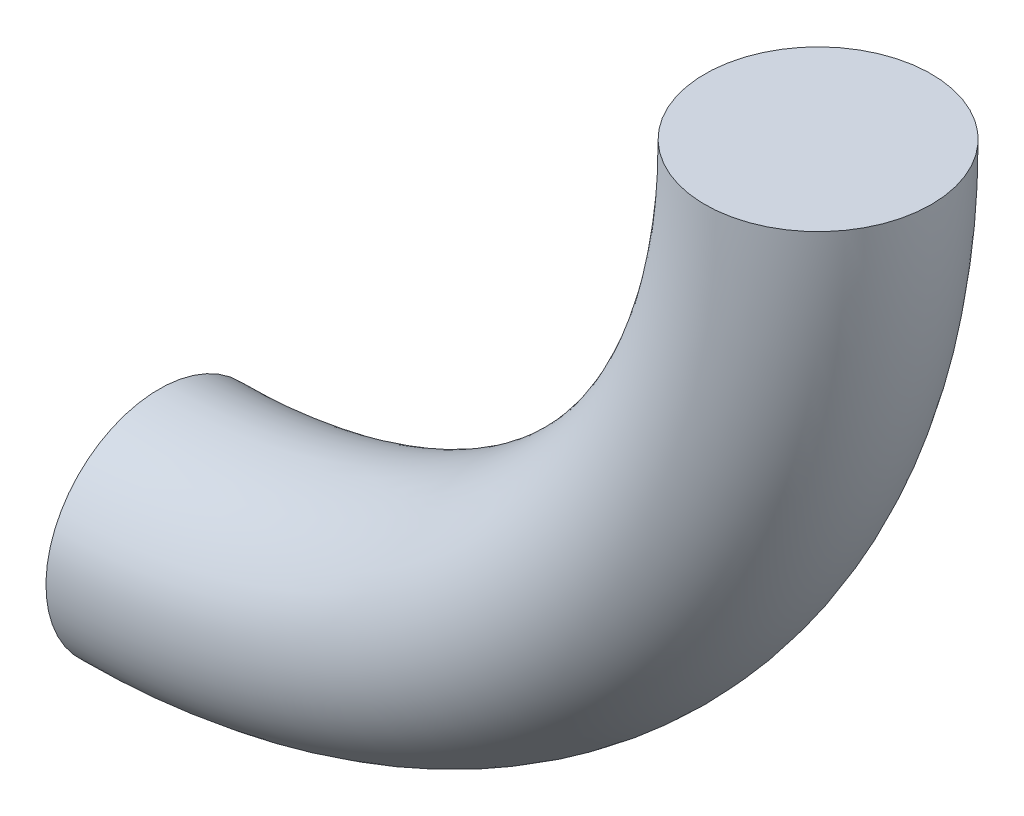
ISO-10303-21;
HEADER;
FILE_DESCRIPTION(('STEP AP214'),'2;1');
FILE_NAME('part.step','',(''),(''),'','','');
FILE_SCHEMA(('AUTOMOTIVE_DESIGN { 1 0 10303 214 1 1 1 1 }'));
ENDSEC;
DATA;
#1=APPLICATION_CONTEXT('core data for automotive mechanical design processes');
#2=APPLICATION_PROTOCOL_DEFINITION('international standard','automotive_design',2000,#1);
#3=PRODUCT_CONTEXT('',#1,'mechanical');
#4=PRODUCT('Part','Part','',(#3));
#5=PRODUCT_RELATED_PRODUCT_CATEGORY('part','',(#4));
#6=PRODUCT_DEFINITION_FORMATION('','',#4);
#7=PRODUCT_DEFINITION_CONTEXT('part definition',#1,'design');
#8=PRODUCT_DEFINITION('design','',#6,#7);
#9=PRODUCT_DEFINITION_SHAPE('','',#8);
#10=(LENGTH_UNIT() NAMED_UNIT(*) SI_UNIT(.MILLI.,.METRE.));
#11=(NAMED_UNIT(*) PLANE_ANGLE_UNIT() SI_UNIT($,.RADIAN.));
#12=(NAMED_UNIT(*) SI_UNIT($,.STERADIAN.) SOLID_ANGLE_UNIT());
#13=UNCERTAINTY_MEASURE_WITH_UNIT(LENGTH_MEASURE(1.E-05),#10,'distance_accuracy_value','');
#14=(GEOMETRIC_REPRESENTATION_CONTEXT(3) GLOBAL_UNCERTAINTY_ASSIGNED_CONTEXT((#13)) GLOBAL_UNIT_ASSIGNED_CONTEXT((#10,
#11,#12)) REPRESENTATION_CONTEXT('',''));
#15=CARTESIAN_POINT('',(0.,0.,0.));
#16=DIRECTION('',(0.,0.,1.));
#17=DIRECTION('',(1.,0.,0.));
#18=AXIS2_PLACEMENT_3D('',#15,#16,#17);
#19=CARTESIAN_POINT('',(0.,0.,0.));
#20=DIRECTION('',(1.,0.,0.));
#21=DIRECTION('',(0.,0.,-1.));
#22=AXIS2_PLACEMENT_3D('',#19,#20,#21);
#23=PLANE('',#22);
#24=CARTESIAN_POINT('',(0.,0.,0.));
#25=DIRECTION('',(1.,0.,0.));
#26=DIRECTION('',(0.,0.,-1.));
#27=AXIS2_PLACEMENT_3D('',#24,#25,#26);
#28=CIRCLE('',#27,7.093);
#29=CARTESIAN_POINT('',(0.,-7.093,0.));
#30=VERTEX_POINT('',#29);
#31=EDGE_CURVE('E44',#30,#30,#28,.T.);
#32=ORIENTED_EDGE('',*,*,#31,.F.);
#33=EDGE_LOOP('',(#32));
#34=FACE_BOUND('',#33,.T.);
#35=ADVANCED_FACE('F39',(#34),#23,.F.);
#36=CARTESIAN_POINT('',(41.297,41.297,0.));
#37=DIRECTION('',(0.,1.,0.));
#38=DIRECTION('',(0.,0.,-1.));
#39=AXIS2_PLACEMENT_3D('',#36,#37,#38);
#40=PLANE('',#39);
#41=CARTESIAN_POINT('',(41.297,41.297,0.));
#42=DIRECTION('',(0.,1.,0.));
#43=DIRECTION('',(0.,0.,-1.));
#44=AXIS2_PLACEMENT_3D('',#41,#42,#43);
#45=CIRCLE('',#44,7.093);
#46=CARTESIAN_POINT('',(48.39,41.297,0.));
#47=VERTEX_POINT('',#46);
#48=EDGE_CURVE('E10',#47,#47,#45,.T.);
#49=ORIENTED_EDGE('',*,*,#48,.T.);
#50=EDGE_LOOP('',(#49));
#51=FACE_BOUND('',#50,.T.);
#52=ADVANCED_FACE('F53',(#51),#40,.T.);
#53=CARTESIAN_POINT('',(0.,41.297,0.));
#54=DIRECTION('',(0.,0.,1.));
#55=DIRECTION('',(1.,0.,0.));
#56=AXIS2_PLACEMENT_3D('',#53,#54,#55);
#57=TOROIDAL_SURFACE('',#56,41.297,7.093);
#58=CARTESIAN_POINT('',(0.,41.297,0.));
#59=DIRECTION('',(0.,0.,1.));
#60=DIRECTION('',(1.,0.,0.));
#61=AXIS2_PLACEMENT_3D('',#58,#59,#60);
#62=CIRCLE('',#61,48.39);
#63=EDGE_CURVE('',#30,#47,#62,.T.);
#64=ORIENTED_EDGE('',*,*,#31,.T.);
#65=ORIENTED_EDGE('',*,*,#48,.F.);
#66=ORIENTED_EDGE('',*,*,#63,.T.);
#67=ORIENTED_EDGE('',*,*,#63,.F.);
#68=EDGE_LOOP('',(#64,#66,#65,#67));
#69=FACE_BOUND('',#68,.T.);
#70=ADVANCED_FACE('F51',(#69),#57,.T.);
#71=CLOSED_SHELL('',(#35,#52,#70));
#72=MANIFOLD_SOLID_BREP('B2',#71);
#73=ADVANCED_BREP_SHAPE_REPRESENTATION('',(#18,#72),#14);
#74=SHAPE_DEFINITION_REPRESENTATION(#9,#73);
ENDSEC;
END-ISO-10303-21;
